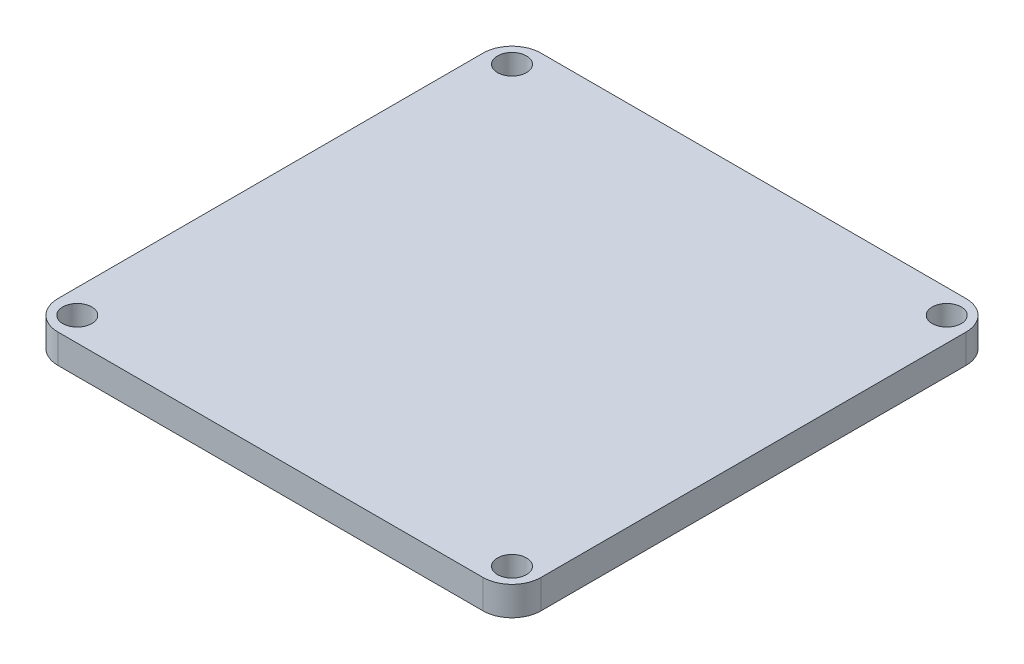
ISO-10303-21;
HEADER;
FILE_DESCRIPTION(('STEP AP214'),'2;1');
FILE_NAME('part.step','',(''),(''),'','','');
FILE_SCHEMA(('AUTOMOTIVE_DESIGN { 1 0 10303 214 1 1 1 1 }'));
ENDSEC;
DATA;
#1=APPLICATION_CONTEXT('core data for automotive mechanical design processes');
#2=APPLICATION_PROTOCOL_DEFINITION('international standard','automotive_design',2000,#1);
#3=PRODUCT_CONTEXT('',#1,'mechanical');
#4=PRODUCT('Part','Part','',(#3));
#5=PRODUCT_RELATED_PRODUCT_CATEGORY('part','',(#4));
#6=PRODUCT_DEFINITION_FORMATION('','',#4);
#7=PRODUCT_DEFINITION_CONTEXT('part definition',#1,'design');
#8=PRODUCT_DEFINITION('design','',#6,#7);
#9=PRODUCT_DEFINITION_SHAPE('','',#8);
#10=(LENGTH_UNIT() NAMED_UNIT(*) SI_UNIT(.MILLI.,.METRE.));
#11=(NAMED_UNIT(*) PLANE_ANGLE_UNIT() SI_UNIT($,.RADIAN.));
#12=(NAMED_UNIT(*) SI_UNIT($,.STERADIAN.) SOLID_ANGLE_UNIT());
#13=UNCERTAINTY_MEASURE_WITH_UNIT(LENGTH_MEASURE(1.E-05),#10,'distance_accuracy_value','');
#14=(GEOMETRIC_REPRESENTATION_CONTEXT(3) GLOBAL_UNCERTAINTY_ASSIGNED_CONTEXT((#13)) GLOBAL_UNIT_ASSIGNED_CONTEXT((#10,
#11,#12)) REPRESENTATION_CONTEXT('',''));
#15=CARTESIAN_POINT('',(0.,0.,0.));
#16=DIRECTION('',(0.,0.,1.));
#17=DIRECTION('',(1.,0.,0.));
#18=AXIS2_PLACEMENT_3D('',#15,#16,#17);
#19=CARTESIAN_POINT('',(-22.,3.,22.));
#20=DIRECTION('',(0.,1.,0.));
#21=DIRECTION('',(0.,0.,1.));
#22=AXIS2_PLACEMENT_3D('',#19,#20,#21);
#23=PLANE('',#22);
#24=CARTESIAN_POINT('',(-22.5,3.,22.5));
#25=DIRECTION('',(0.,1.,0.));
#26=DIRECTION('',(0.,0.,1.));
#27=AXIS2_PLACEMENT_3D('',#24,#25,#26);
#28=CIRCLE('',#27,1.5);
#29=CARTESIAN_POINT('',(-22.5,3.,24.));
#30=VERTEX_POINT('',#29);
#31=EDGE_CURVE('E188',#30,#30,#28,.T.);
#32=ORIENTED_EDGE('',*,*,#31,.F.);
#33=EDGE_LOOP('',(#32));
#34=FACE_BOUND('',#33,.T.);
#35=CARTESIAN_POINT('',(-22.5,3.,-22.5));
#36=DIRECTION('',(0.,1.,0.));
#37=DIRECTION('',(0.,0.,1.));
#38=AXIS2_PLACEMENT_3D('',#35,#36,#37);
#39=CIRCLE('',#38,1.5);
#40=CARTESIAN_POINT('',(-22.5,3.,-21.));
#41=VERTEX_POINT('',#40);
#42=EDGE_CURVE('E134',#41,#41,#39,.T.);
#43=ORIENTED_EDGE('',*,*,#42,.F.);
#44=EDGE_LOOP('',(#43));
#45=FACE_BOUND('',#44,.T.);
#46=CARTESIAN_POINT('',(-22.,3.,22.));
#47=DIRECTION('',(0.,1.,0.));
#48=DIRECTION('',(0.,0.,1.));
#49=AXIS2_PLACEMENT_3D('',#46,#47,#48);
#50=CIRCLE('',#49,3.);
#51=CARTESIAN_POINT('',(-25.,3.,22.));
#52=VERTEX_POINT('',#51);
#53=CARTESIAN_POINT('',(-22.,3.,25.));
#54=VERTEX_POINT('',#53);
#55=EDGE_CURVE('E145',#52,#54,#50,.T.);
#56=ORIENTED_EDGE('',*,*,#55,.T.);
#57=DIRECTION('',(1.,0.,0.));
#58=VECTOR('',#57,1.);
#59=CARTESIAN_POINT('',(-22.,3.,25.));
#60=LINE('',#59,#58);
#61=CARTESIAN_POINT('',(22.,3.,25.));
#62=VERTEX_POINT('',#61);
#63=EDGE_CURVE('E93',#54,#62,#60,.T.);
#64=ORIENTED_EDGE('',*,*,#63,.T.);
#65=CARTESIAN_POINT('',(22.,3.,22.));
#66=DIRECTION('',(0.,1.,0.));
#67=DIRECTION('',(0.,0.,1.));
#68=AXIS2_PLACEMENT_3D('',#65,#66,#67);
#69=CIRCLE('',#68,3.);
#70=CARTESIAN_POINT('',(25.,3.,22.));
#71=VERTEX_POINT('',#70);
#72=EDGE_CURVE('E160',#62,#71,#69,.T.);
#73=ORIENTED_EDGE('',*,*,#72,.T.);
#74=DIRECTION('',(0.,0.,-1.));
#75=VECTOR('',#74,1.);
#76=CARTESIAN_POINT('',(25.,3.,-22.));
#77=LINE('',#76,#75);
#78=CARTESIAN_POINT('',(25.,3.,-22.));
#79=VERTEX_POINT('',#78);
#80=EDGE_CURVE('E173',#71,#79,#77,.T.);
#81=ORIENTED_EDGE('',*,*,#80,.T.);
#82=CARTESIAN_POINT('',(22.,3.,-22.));
#83=DIRECTION('',(0.,1.,0.));
#84=DIRECTION('',(0.,0.,-1.));
#85=AXIS2_PLACEMENT_3D('',#82,#83,#84);
#86=CIRCLE('',#85,3.);
#87=CARTESIAN_POINT('',(22.,3.,-25.));
#88=VERTEX_POINT('',#87);
#89=EDGE_CURVE('E112',#79,#88,#86,.T.);
#90=ORIENTED_EDGE('',*,*,#89,.T.);
#91=DIRECTION('',(-1.,0.,0.));
#92=VECTOR('',#91,1.);
#93=CARTESIAN_POINT('',(-22.,3.,-25.));
#94=LINE('',#93,#92);
#95=CARTESIAN_POINT('',(-22.,3.,-25.));
#96=VERTEX_POINT('',#95);
#97=EDGE_CURVE('E106',#88,#96,#94,.T.);
#98=ORIENTED_EDGE('',*,*,#97,.T.);
#99=CARTESIAN_POINT('',(-22.,3.,-22.));
#100=DIRECTION('',(0.,1.,0.));
#101=DIRECTION('',(0.,0.,1.));
#102=AXIS2_PLACEMENT_3D('',#99,#100,#101);
#103=CIRCLE('',#102,3.);
#104=CARTESIAN_POINT('',(-25.,3.,-22.));
#105=VERTEX_POINT('',#104);
#106=EDGE_CURVE('E110',#96,#105,#103,.T.);
#107=ORIENTED_EDGE('',*,*,#106,.T.);
#108=DIRECTION('',(0.,0.,1.));
#109=VECTOR('',#108,1.);
#110=CARTESIAN_POINT('',(-25.,3.,-22.));
#111=LINE('',#110,#109);
#112=EDGE_CURVE('E50',#105,#52,#111,.T.);
#113=ORIENTED_EDGE('',*,*,#112,.T.);
#114=EDGE_LOOP('',(#56,#64,#73,#81,#90,#98,#107,#113));
#115=FACE_BOUND('',#114,.T.);
#116=CARTESIAN_POINT('',(22.5,3.,-22.5));
#117=DIRECTION('',(0.,1.,0.));
#118=DIRECTION('',(0.,0.,1.));
#119=AXIS2_PLACEMENT_3D('',#116,#117,#118);
#120=CIRCLE('',#119,1.5);
#121=CARTESIAN_POINT('',(22.5,3.,-21.));
#122=VERTEX_POINT('',#121);
#123=EDGE_CURVE('E182',#122,#122,#120,.T.);
#124=ORIENTED_EDGE('',*,*,#123,.F.);
#125=EDGE_LOOP('',(#124));
#126=FACE_BOUND('',#125,.T.);
#127=CARTESIAN_POINT('',(22.5,3.,22.5));
#128=DIRECTION('',(0.,1.,0.));
#129=DIRECTION('',(0.,0.,1.));
#130=AXIS2_PLACEMENT_3D('',#127,#128,#129);
#131=CIRCLE('',#130,1.5);
#132=CARTESIAN_POINT('',(22.5,3.,24.));
#133=VERTEX_POINT('',#132);
#134=EDGE_CURVE('E194',#133,#133,#131,.T.);
#135=ORIENTED_EDGE('',*,*,#134,.F.);
#136=EDGE_LOOP('',(#135));
#137=FACE_BOUND('',#136,.T.);
#138=ADVANCED_FACE('F33',(#34,#45,#115,#126,#137),#23,.T.);
#139=CARTESIAN_POINT('',(-22.,0.,22.));
#140=DIRECTION('',(0.,1.,0.));
#141=DIRECTION('',(0.,0.,1.));
#142=AXIS2_PLACEMENT_3D('',#139,#140,#141);
#143=PLANE('',#142);
#144=CARTESIAN_POINT('',(-22.5,0.,22.5));
#145=DIRECTION('',(0.,1.,0.));
#146=DIRECTION('',(0.,0.,1.));
#147=AXIS2_PLACEMENT_3D('',#144,#145,#146);
#148=CIRCLE('',#147,1.5);
#149=CARTESIAN_POINT('',(-22.5,0.,24.));
#150=VERTEX_POINT('',#149);
#151=EDGE_CURVE('E191',#150,#150,#148,.T.);
#152=ORIENTED_EDGE('',*,*,#151,.T.);
#153=EDGE_LOOP('',(#152));
#154=FACE_BOUND('',#153,.T.);
#155=CARTESIAN_POINT('',(-22.5,0.,-22.5));
#156=DIRECTION('',(0.,1.,0.));
#157=DIRECTION('',(0.,0.,1.));
#158=AXIS2_PLACEMENT_3D('',#155,#156,#157);
#159=CIRCLE('',#158,1.5);
#160=CARTESIAN_POINT('',(-22.5,0.,-21.));
#161=VERTEX_POINT('',#160);
#162=EDGE_CURVE('E179',#161,#161,#159,.T.);
#163=ORIENTED_EDGE('',*,*,#162,.T.);
#164=EDGE_LOOP('',(#163));
#165=FACE_BOUND('',#164,.T.);
#166=CARTESIAN_POINT('',(-22.,0.,22.));
#167=DIRECTION('',(0.,1.,0.));
#168=DIRECTION('',(0.,0.,1.));
#169=AXIS2_PLACEMENT_3D('',#166,#167,#168);
#170=CIRCLE('',#169,3.);
#171=CARTESIAN_POINT('',(-25.,0.,22.));
#172=VERTEX_POINT('',#171);
#173=CARTESIAN_POINT('',(-22.,0.,25.));
#174=VERTEX_POINT('',#173);
#175=EDGE_CURVE('E130',#172,#174,#170,.T.);
#176=ORIENTED_EDGE('',*,*,#175,.F.);
#177=DIRECTION('',(0.,0.,1.));
#178=VECTOR('',#177,1.);
#179=CARTESIAN_POINT('',(-25.,0.,-22.));
#180=LINE('',#179,#178);
#181=CARTESIAN_POINT('',(-25.,0.,-22.));
#182=VERTEX_POINT('',#181);
#183=EDGE_CURVE('E85',#182,#172,#180,.T.);
#184=ORIENTED_EDGE('',*,*,#183,.F.);
#185=CARTESIAN_POINT('',(-22.,0.,-22.));
#186=DIRECTION('',(0.,1.,0.));
#187=DIRECTION('',(0.,0.,1.));
#188=AXIS2_PLACEMENT_3D('',#185,#186,#187);
#189=CIRCLE('',#188,3.);
#190=CARTESIAN_POINT('',(-22.,0.,-25.));
#191=VERTEX_POINT('',#190);
#192=EDGE_CURVE('E79',#191,#182,#189,.T.);
#193=ORIENTED_EDGE('',*,*,#192,.F.);
#194=DIRECTION('',(-1.,0.,0.));
#195=VECTOR('',#194,1.);
#196=CARTESIAN_POINT('',(-22.,0.,-25.));
#197=LINE('',#196,#195);
#198=CARTESIAN_POINT('',(22.,0.,-25.));
#199=VERTEX_POINT('',#198);
#200=EDGE_CURVE('E120',#199,#191,#197,.T.);
#201=ORIENTED_EDGE('',*,*,#200,.F.);
#202=CARTESIAN_POINT('',(22.,0.,-22.));
#203=DIRECTION('',(0.,1.,0.));
#204=DIRECTION('',(0.,0.,-1.));
#205=AXIS2_PLACEMENT_3D('',#202,#203,#204);
#206=CIRCLE('',#205,3.);
#207=CARTESIAN_POINT('',(25.,0.,-22.));
#208=VERTEX_POINT('',#207);
#209=EDGE_CURVE('E140',#208,#199,#206,.T.);
#210=ORIENTED_EDGE('',*,*,#209,.F.);
#211=DIRECTION('',(0.,0.,-1.));
#212=VECTOR('',#211,1.);
#213=CARTESIAN_POINT('',(25.,0.,-22.));
#214=LINE('',#213,#212);
#215=CARTESIAN_POINT('',(25.,0.,22.));
#216=VERTEX_POINT('',#215);
#217=EDGE_CURVE('E138',#216,#208,#214,.T.);
#218=ORIENTED_EDGE('',*,*,#217,.F.);
#219=CARTESIAN_POINT('',(22.,0.,22.));
#220=DIRECTION('',(0.,1.,0.));
#221=DIRECTION('',(0.,0.,1.));
#222=AXIS2_PLACEMENT_3D('',#219,#220,#221);
#223=CIRCLE('',#222,3.);
#224=CARTESIAN_POINT('',(22.,0.,25.));
#225=VERTEX_POINT('',#224);
#226=EDGE_CURVE('E136',#225,#216,#223,.T.);
#227=ORIENTED_EDGE('',*,*,#226,.F.);
#228=DIRECTION('',(1.,0.,0.));
#229=VECTOR('',#228,1.);
#230=CARTESIAN_POINT('',(-22.,0.,25.));
#231=LINE('',#230,#229);
#232=EDGE_CURVE('E133',#174,#225,#231,.T.);
#233=ORIENTED_EDGE('',*,*,#232,.F.);
#234=EDGE_LOOP('',(#176,#184,#193,#201,#210,#218,#227,#233));
#235=FACE_BOUND('',#234,.T.);
#236=CARTESIAN_POINT('',(22.5,0.,-22.5));
#237=DIRECTION('',(0.,1.,0.));
#238=DIRECTION('',(0.,0.,1.));
#239=AXIS2_PLACEMENT_3D('',#236,#237,#238);
#240=CIRCLE('',#239,1.5);
#241=CARTESIAN_POINT('',(22.5,0.,-21.));
#242=VERTEX_POINT('',#241);
#243=EDGE_CURVE('E185',#242,#242,#240,.T.);
#244=ORIENTED_EDGE('',*,*,#243,.T.);
#245=EDGE_LOOP('',(#244));
#246=FACE_BOUND('',#245,.T.);
#247=CARTESIAN_POINT('',(22.5,0.,22.5));
#248=DIRECTION('',(0.,1.,0.));
#249=DIRECTION('',(0.,0.,1.));
#250=AXIS2_PLACEMENT_3D('',#247,#248,#249);
#251=CIRCLE('',#250,1.5);
#252=CARTESIAN_POINT('',(22.5,0.,24.));
#253=VERTEX_POINT('',#252);
#254=EDGE_CURVE('E197',#253,#253,#251,.T.);
#255=ORIENTED_EDGE('',*,*,#254,.T.);
#256=EDGE_LOOP('',(#255));
#257=FACE_BOUND('',#256,.T.);
#258=ADVANCED_FACE('F164',(#154,#165,#235,#246,#257),#143,.F.);
#259=CARTESIAN_POINT('',(-22.,3.,22.));
#260=DIRECTION('',(0.,-1.,0.));
#261=DIRECTION('',(0.,0.,-1.));
#262=AXIS2_PLACEMENT_3D('',#259,#260,#261);
#263=CYLINDRICAL_SURFACE('',#262,3.);
#264=ORIENTED_EDGE('',*,*,#175,.T.);
#265=DIRECTION('',(0.,-1.,0.));
#266=VECTOR('',#265,1.);
#267=CARTESIAN_POINT('',(-22.,3.,25.));
#268=LINE('',#267,#266);
#269=EDGE_CURVE('E11',#54,#174,#268,.T.);
#270=ORIENTED_EDGE('',*,*,#269,.F.);
#271=ORIENTED_EDGE('',*,*,#55,.F.);
#272=DIRECTION('',(0.,-1.,0.));
#273=VECTOR('',#272,1.);
#274=CARTESIAN_POINT('',(-25.,3.,22.));
#275=LINE('',#274,#273);
#276=EDGE_CURVE('E126',#52,#172,#275,.T.);
#277=ORIENTED_EDGE('',*,*,#276,.T.);
#278=EDGE_LOOP('',(#264,#270,#271,#277));
#279=FACE_BOUND('',#278,.T.);
#280=ADVANCED_FACE('F35',(#279),#263,.T.);
#281=CARTESIAN_POINT('',(-22.,3.,25.));
#282=DIRECTION('',(0.,0.,-1.));
#283=DIRECTION('',(-1.,0.,0.));
#284=AXIS2_PLACEMENT_3D('',#281,#282,#283);
#285=PLANE('',#284);
#286=ORIENTED_EDGE('',*,*,#232,.T.);
#287=DIRECTION('',(0.,-1.,0.));
#288=VECTOR('',#287,1.);
#289=CARTESIAN_POINT('',(22.,3.,25.));
#290=LINE('',#289,#288);
#291=EDGE_CURVE('E42',#62,#225,#290,.T.);
#292=ORIENTED_EDGE('',*,*,#291,.F.);
#293=ORIENTED_EDGE('',*,*,#63,.F.);
#294=ORIENTED_EDGE('',*,*,#269,.T.);
#295=EDGE_LOOP('',(#286,#292,#293,#294));
#296=FACE_BOUND('',#295,.T.);
#297=ADVANCED_FACE('F232',(#296),#285,.F.);
#298=CARTESIAN_POINT('',(22.,3.,22.));
#299=DIRECTION('',(0.,-1.,0.));
#300=DIRECTION('',(0.,0.,-1.));
#301=AXIS2_PLACEMENT_3D('',#298,#299,#300);
#302=CYLINDRICAL_SURFACE('',#301,3.);
#303=ORIENTED_EDGE('',*,*,#226,.T.);
#304=DIRECTION('',(0.,-1.,0.));
#305=VECTOR('',#304,1.);
#306=CARTESIAN_POINT('',(25.,3.,22.));
#307=LINE('',#306,#305);
#308=EDGE_CURVE('E152',#71,#216,#307,.T.);
#309=ORIENTED_EDGE('',*,*,#308,.F.);
#310=ORIENTED_EDGE('',*,*,#72,.F.);
#311=ORIENTED_EDGE('',*,*,#291,.T.);
#312=EDGE_LOOP('',(#303,#309,#310,#311));
#313=FACE_BOUND('',#312,.T.);
#314=ADVANCED_FACE('F158',(#313),#302,.T.);
#315=CARTESIAN_POINT('',(25.,3.,-22.));
#316=DIRECTION('',(-1.,0.,0.));
#317=DIRECTION('',(0.,0.,1.));
#318=AXIS2_PLACEMENT_3D('',#315,#316,#317);
#319=PLANE('',#318);
#320=ORIENTED_EDGE('',*,*,#217,.T.);
#321=DIRECTION('',(0.,-1.,0.));
#322=VECTOR('',#321,1.);
#323=CARTESIAN_POINT('',(25.,3.,-22.));
#324=LINE('',#323,#322);
#325=EDGE_CURVE('E149',#79,#208,#324,.T.);
#326=ORIENTED_EDGE('',*,*,#325,.F.);
#327=ORIENTED_EDGE('',*,*,#80,.F.);
#328=ORIENTED_EDGE('',*,*,#308,.T.);
#329=EDGE_LOOP('',(#320,#326,#327,#328));
#330=FACE_BOUND('',#329,.T.);
#331=ADVANCED_FACE('F169',(#330),#319,.F.);
#332=CARTESIAN_POINT('',(22.,3.,-22.));
#333=DIRECTION('',(0.,-1.,0.));
#334=DIRECTION('',(0.,0.,-1.));
#335=AXIS2_PLACEMENT_3D('',#332,#333,#334);
#336=CYLINDRICAL_SURFACE('',#335,3.);
#337=ORIENTED_EDGE('',*,*,#209,.T.);
#338=DIRECTION('',(0.,-1.,0.));
#339=VECTOR('',#338,1.);
#340=CARTESIAN_POINT('',(22.,3.,-25.));
#341=LINE('',#340,#339);
#342=EDGE_CURVE('E121',#88,#199,#341,.T.);
#343=ORIENTED_EDGE('',*,*,#342,.F.);
#344=ORIENTED_EDGE('',*,*,#89,.F.);
#345=ORIENTED_EDGE('',*,*,#325,.T.);
#346=EDGE_LOOP('',(#337,#343,#344,#345));
#347=FACE_BOUND('',#346,.T.);
#348=ADVANCED_FACE('F172',(#347),#336,.T.);
#349=CARTESIAN_POINT('',(-22.,3.,-25.));
#350=DIRECTION('',(0.,0.,1.));
#351=DIRECTION('',(1.,0.,0.));
#352=AXIS2_PLACEMENT_3D('',#349,#350,#351);
#353=PLANE('',#352);
#354=ORIENTED_EDGE('',*,*,#200,.T.);
#355=DIRECTION('',(0.,-1.,0.));
#356=VECTOR('',#355,1.);
#357=CARTESIAN_POINT('',(-22.,3.,-25.));
#358=LINE('',#357,#356);
#359=EDGE_CURVE('E117',#96,#191,#358,.T.);
#360=ORIENTED_EDGE('',*,*,#359,.F.);
#361=ORIENTED_EDGE('',*,*,#97,.F.);
#362=ORIENTED_EDGE('',*,*,#342,.T.);
#363=EDGE_LOOP('',(#354,#360,#361,#362));
#364=FACE_BOUND('',#363,.T.);
#365=ADVANCED_FACE('F118',(#364),#353,.F.);
#366=CARTESIAN_POINT('',(-22.,3.,-22.));
#367=DIRECTION('',(0.,-1.,0.));
#368=DIRECTION('',(0.,0.,-1.));
#369=AXIS2_PLACEMENT_3D('',#366,#367,#368);
#370=CYLINDRICAL_SURFACE('',#369,3.);
#371=ORIENTED_EDGE('',*,*,#192,.T.);
#372=DIRECTION('',(0.,-1.,0.));
#373=VECTOR('',#372,1.);
#374=CARTESIAN_POINT('',(-25.,3.,-22.));
#375=LINE('',#374,#373);
#376=EDGE_CURVE('E122',#105,#182,#375,.T.);
#377=ORIENTED_EDGE('',*,*,#376,.F.);
#378=ORIENTED_EDGE('',*,*,#106,.F.);
#379=ORIENTED_EDGE('',*,*,#359,.T.);
#380=EDGE_LOOP('',(#371,#377,#378,#379));
#381=FACE_BOUND('',#380,.T.);
#382=ADVANCED_FACE('F124',(#381),#370,.T.);
#383=CARTESIAN_POINT('',(-25.,3.,-22.));
#384=DIRECTION('',(1.,0.,0.));
#385=DIRECTION('',(0.,0.,-1.));
#386=AXIS2_PLACEMENT_3D('',#383,#384,#385);
#387=PLANE('',#386);
#388=ORIENTED_EDGE('',*,*,#183,.T.);
#389=ORIENTED_EDGE('',*,*,#276,.F.);
#390=ORIENTED_EDGE('',*,*,#112,.F.);
#391=ORIENTED_EDGE('',*,*,#376,.T.);
#392=EDGE_LOOP('',(#388,#389,#390,#391));
#393=FACE_BOUND('',#392,.T.);
#394=ADVANCED_FACE('F220',(#393),#387,.F.);
#395=CARTESIAN_POINT('',(-22.5,3.,-22.5));
#396=DIRECTION('',(0.,-1.,0.));
#397=DIRECTION('',(0.,0.,-1.));
#398=AXIS2_PLACEMENT_3D('',#395,#396,#397);
#399=CYLINDRICAL_SURFACE('',#398,1.5);
#400=ORIENTED_EDGE('',*,*,#42,.T.);
#401=EDGE_LOOP('',(#400));
#402=FACE_BOUND('',#401,.T.);
#403=ORIENTED_EDGE('',*,*,#162,.F.);
#404=EDGE_LOOP('',(#403));
#405=FACE_BOUND('',#404,.T.);
#406=ADVANCED_FACE('F217',(#402,#405),#399,.F.);
#407=CARTESIAN_POINT('',(22.5,3.,-22.5));
#408=DIRECTION('',(0.,-1.,0.));
#409=DIRECTION('',(0.,0.,-1.));
#410=AXIS2_PLACEMENT_3D('',#407,#408,#409);
#411=CYLINDRICAL_SURFACE('',#410,1.5);
#412=ORIENTED_EDGE('',*,*,#123,.T.);
#413=EDGE_LOOP('',(#412));
#414=FACE_BOUND('',#413,.T.);
#415=ORIENTED_EDGE('',*,*,#243,.F.);
#416=EDGE_LOOP('',(#415));
#417=FACE_BOUND('',#416,.T.);
#418=ADVANCED_FACE('F296',(#414,#417),#411,.F.);
#419=CARTESIAN_POINT('',(-22.5,3.,22.5));
#420=DIRECTION('',(0.,-1.,0.));
#421=DIRECTION('',(0.,0.,-1.));
#422=AXIS2_PLACEMENT_3D('',#419,#420,#421);
#423=CYLINDRICAL_SURFACE('',#422,1.5);
#424=ORIENTED_EDGE('',*,*,#31,.T.);
#425=EDGE_LOOP('',(#424));
#426=FACE_BOUND('',#425,.T.);
#427=ORIENTED_EDGE('',*,*,#151,.F.);
#428=EDGE_LOOP('',(#427));
#429=FACE_BOUND('',#428,.T.);
#430=ADVANCED_FACE('F304',(#426,#429),#423,.F.);
#431=CARTESIAN_POINT('',(22.5,3.,22.5));
#432=DIRECTION('',(0.,-1.,0.));
#433=DIRECTION('',(0.,0.,-1.));
#434=AXIS2_PLACEMENT_3D('',#431,#432,#433);
#435=CYLINDRICAL_SURFACE('',#434,1.5);
#436=ORIENTED_EDGE('',*,*,#134,.T.);
#437=EDGE_LOOP('',(#436));
#438=FACE_BOUND('',#437,.T.);
#439=ORIENTED_EDGE('',*,*,#254,.F.);
#440=EDGE_LOOP('',(#439));
#441=FACE_BOUND('',#440,.T.);
#442=ADVANCED_FACE('F203',(#438,#441),#435,.F.);
#443=CLOSED_SHELL('',(#138,#258,#280,#297,#314,#331,#348,#365,#382,#394,#406,#418,#430,#442));
#444=MANIFOLD_SOLID_BREP('B2',#443);
#445=ADVANCED_BREP_SHAPE_REPRESENTATION('',(#18,#444),#14);
#446=SHAPE_DEFINITION_REPRESENTATION(#9,#445);
ENDSEC;
END-ISO-10303-21;
